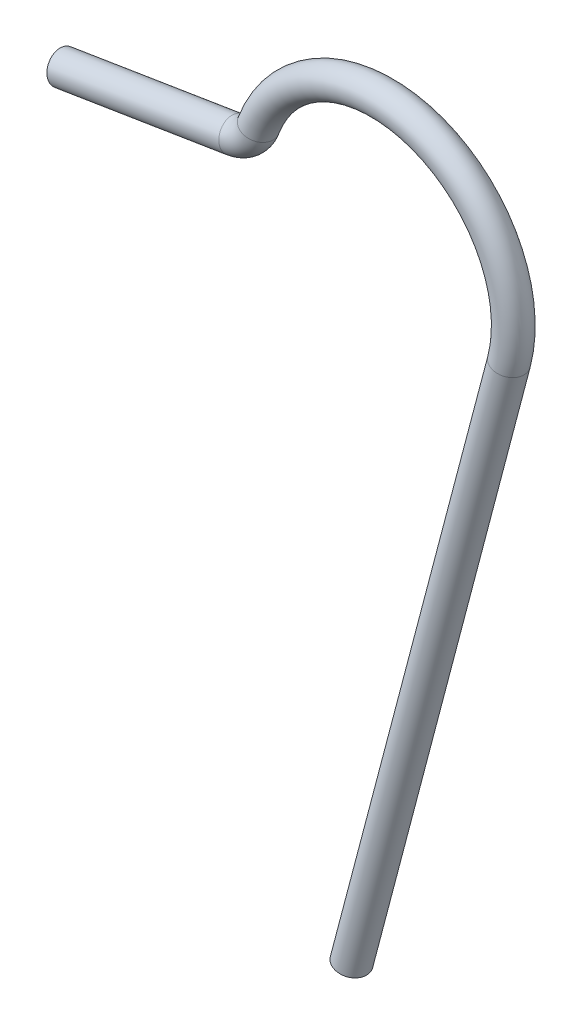
ISO-10303-21;
HEADER;
FILE_DESCRIPTION(('STEP AP214'),'2;1');
FILE_NAME('part.step','',(''),(''),'','','');
FILE_SCHEMA(('AUTOMOTIVE_DESIGN { 1 0 10303 214 1 1 1 1 }'));
ENDSEC;
DATA;
#1=APPLICATION_CONTEXT('core data for automotive mechanical design processes');
#2=APPLICATION_PROTOCOL_DEFINITION('international standard','automotive_design',2000,#1);
#3=PRODUCT_CONTEXT('',#1,'mechanical');
#4=PRODUCT('Part','Part','',(#3));
#5=PRODUCT_RELATED_PRODUCT_CATEGORY('part','',(#4));
#6=PRODUCT_DEFINITION_FORMATION('','',#4);
#7=PRODUCT_DEFINITION_CONTEXT('part definition',#1,'design');
#8=PRODUCT_DEFINITION('design','',#6,#7);
#9=PRODUCT_DEFINITION_SHAPE('','',#8);
#10=(LENGTH_UNIT() NAMED_UNIT(*) SI_UNIT(.MILLI.,.METRE.));
#11=(NAMED_UNIT(*) PLANE_ANGLE_UNIT() SI_UNIT($,.RADIAN.));
#12=(NAMED_UNIT(*) SI_UNIT($,.STERADIAN.) SOLID_ANGLE_UNIT());
#13=UNCERTAINTY_MEASURE_WITH_UNIT(LENGTH_MEASURE(1.E-05),#10,'distance_accuracy_value','');
#14=(GEOMETRIC_REPRESENTATION_CONTEXT(3) GLOBAL_UNCERTAINTY_ASSIGNED_CONTEXT((#13)) GLOBAL_UNIT_ASSIGNED_CONTEXT((#10,
#11,#12)) REPRESENTATION_CONTEXT('',''));
#15=CARTESIAN_POINT('',(0.,0.,0.));
#16=DIRECTION('',(0.,0.,1.));
#17=DIRECTION('',(1.,0.,0.));
#18=AXIS2_PLACEMENT_3D('',#15,#16,#17);
#19=CARTESIAN_POINT('',(-0.716575776889885,-0.42551557080019,0.));
#20=DIRECTION('',(-0.254412748581786,-0.967095731227814,0.));
#21=DIRECTION('',(0.967095731227815,-0.254412748581786,0.));
#22=AXIS2_PLACEMENT_3D('',#19,#20,#21);
#23=CYLINDRICAL_SURFACE('',#22,0.1);
#24=CARTESIAN_POINT('',(-0.716575776889885,-0.42551557080019,0.));
#25=DIRECTION('',(-0.254412748581782,-0.967095731227815,0.));
#26=DIRECTION('',(0.967095731227816,-0.254412748581782,0.));
#27=AXIS2_PLACEMENT_3D('',#24,#25,#26);
#28=CIRCLE('',#27,0.1);
#29=CARTESIAN_POINT('',(-0.619866203767104,-0.450956845658368,0.));
#30=VERTEX_POINT('',#29);
#31=EDGE_CURVE('E37',#30,#30,#28,.T.);
#32=ORIENTED_EDGE('',*,*,#31,.T.);
#33=EDGE_LOOP('',(#32));
#34=FACE_BOUND('',#33,.T.);
#35=CARTESIAN_POINT('',(-1.73422677121703,-4.29389849571145,0.));
#36=DIRECTION('',(-0.254412748581782,-0.967095731227815,0.));
#37=DIRECTION('',(0.967095731227816,-0.254412748581782,0.));
#38=AXIS2_PLACEMENT_3D('',#35,#36,#37);
#39=CIRCLE('',#38,0.1);
#40=CARTESIAN_POINT('',(-1.63751719809425,-4.31933977056962,0.));
#41=VERTEX_POINT('',#40);
#42=EDGE_CURVE('E10',#41,#41,#39,.T.);
#43=ORIENTED_EDGE('',*,*,#42,.F.);
#44=EDGE_LOOP('',(#43));
#45=FACE_BOUND('',#44,.T.);
#46=ADVANCED_FACE('F31',(#34,#45),#23,.T.);
#47=CARTESIAN_POINT('',(-1.53860714843353,-0.209264734505673,0.));
#48=DIRECTION('',(0.,0.,-1.));
#49=DIRECTION('',(-1.,0.,0.));
#50=AXIS2_PLACEMENT_3D('',#47,#48,#49);
#51=TOROIDAL_SURFACE('',#50,0.85,0.1);
#52=CARTESIAN_POINT('',(-2.33479653458232,0.0883633242925799,0.));
#53=DIRECTION('',(0.350150657409707,0.936693395469163,0.));
#54=DIRECTION('',(-0.936693395469163,0.350150657409707,0.));
#55=AXIS2_PLACEMENT_3D('',#52,#53,#54);
#56=CIRCLE('',#55,0.1);
#57=CARTESIAN_POINT('',(-2.42846587412923,0.123378390033551,0.));
#58=VERTEX_POINT('',#57);
#59=EDGE_CURVE('E41',#58,#58,#56,.T.);
#60=CARTESIAN_POINT('',(-1.53860714843353,-0.209264734505673,0.));
#61=DIRECTION('',(0.,0.,-1.));
#62=DIRECTION('',(-1.,0.,0.));
#63=AXIS2_PLACEMENT_3D('',#60,#61,#62);
#64=CIRCLE('',#63,0.95);
#65=EDGE_CURVE('',#58,#30,#64,.T.);
#66=ORIENTED_EDGE('',*,*,#59,.T.);
#67=ORIENTED_EDGE('',*,*,#31,.F.);
#68=ORIENTED_EDGE('',*,*,#65,.T.);
#69=ORIENTED_EDGE('',*,*,#65,.F.);
#70=EDGE_LOOP('',(#66,#68,#67,#69));
#71=FACE_BOUND('',#70,.T.);
#72=ADVANCED_FACE('F72',(#71),#51,.T.);
#73=CARTESIAN_POINT('',(-2.52213521367615,0.158393455774524,0.));
#74=DIRECTION('',(0.,0.,1.));
#75=DIRECTION('',(1.,0.,0.));
#76=AXIS2_PLACEMENT_3D('',#73,#74,#75);
#77=TOROIDAL_SURFACE('',#76,0.2,0.1);
#78=CARTESIAN_POINT('',(-2.49027359739103,-0.0390523276894433,0.));
#79=DIRECTION('',(0.987228917319833,0.159308081425617,0.));
#80=DIRECTION('',(-0.159308081425617,0.987228917319833,0.));
#81=AXIS2_PLACEMENT_3D('',#78,#79,#80);
#82=CIRCLE('',#81,0.1);
#83=CARTESIAN_POINT('',(-2.50620440553359,0.05967056404254,0.));
#84=VERTEX_POINT('',#83);
#85=EDGE_CURVE('E45',#84,#84,#82,.T.);
#86=ORIENTED_EDGE('',*,*,#85,.T.);
#87=EDGE_LOOP('',(#86));
#88=FACE_BOUND('',#87,.T.);
#89=ORIENTED_EDGE('',*,*,#59,.F.);
#90=EDGE_LOOP('',(#89));
#91=FACE_BOUND('',#90,.T.);
#92=ADVANCED_FACE('F54',(#88,#91),#77,.T.);
#93=CARTESIAN_POINT('',(-2.49027359739103,-0.0390523276894433,0.));
#94=DIRECTION('',(-0.987228917319833,-0.159308081425613,0.));
#95=DIRECTION('',(0.159308081425613,-0.987228917319833,0.));
#96=AXIS2_PLACEMENT_3D('',#93,#94,#95);
#97=CYLINDRICAL_SURFACE('',#96,0.1);
#98=ORIENTED_EDGE('',*,*,#85,.F.);
#99=EDGE_LOOP('',(#98));
#100=FACE_BOUND('',#99,.T.);
#101=CARTESIAN_POINT('',(-3.60111474002096,-0.218307582571406,0.));
#102=DIRECTION('',(0.987228917319833,0.159308081425617,0.));
#103=DIRECTION('',(-0.159308081425617,0.987228917319833,0.));
#104=AXIS2_PLACEMENT_3D('',#101,#102,#103);
#105=CIRCLE('',#104,0.1);
#106=CARTESIAN_POINT('',(-3.61704554816353,-0.119584690839423,0.));
#107=VERTEX_POINT('',#106);
#108=EDGE_CURVE('E48',#107,#107,#105,.T.);
#109=ORIENTED_EDGE('',*,*,#108,.T.);
#110=EDGE_LOOP('',(#109));
#111=FACE_BOUND('',#110,.T.);
#112=ADVANCED_FACE('F57',(#100,#111),#97,.T.);
#113=CARTESIAN_POINT('',(-1.73422677121703,-4.29389849571145,0.));
#114=DIRECTION('',(-0.254412748581782,-0.967095731227815,0.));
#115=DIRECTION('',(0.967095731227816,-0.254412748581782,0.));
#116=AXIS2_PLACEMENT_3D('',#113,#114,#115);
#117=PLANE('',#116);
#118=ORIENTED_EDGE('',*,*,#42,.T.);
#119=EDGE_LOOP('',(#118));
#120=FACE_BOUND('',#119,.T.);
#121=ADVANCED_FACE('F60',(#120),#117,.T.);
#122=CARTESIAN_POINT('',(-3.60111474002096,-0.218307582571406,0.));
#123=DIRECTION('',(0.987228917319833,0.159308081425617,0.));
#124=DIRECTION('',(-0.159308081425617,0.987228917319833,0.));
#125=AXIS2_PLACEMENT_3D('',#122,#123,#124);
#126=PLANE('',#125);
#127=ORIENTED_EDGE('',*,*,#108,.F.);
#128=EDGE_LOOP('',(#127));
#129=FACE_BOUND('',#128,.T.);
#130=ADVANCED_FACE('F64',(#129),#126,.F.);
#131=CLOSED_SHELL('',(#46,#72,#92,#112,#121,#130));
#132=MANIFOLD_SOLID_BREP('B2',#131);
#133=ADVANCED_BREP_SHAPE_REPRESENTATION('',(#18,#132),#14);
#134=SHAPE_DEFINITION_REPRESENTATION(#9,#133);
ENDSEC;
END-ISO-10303-21;
